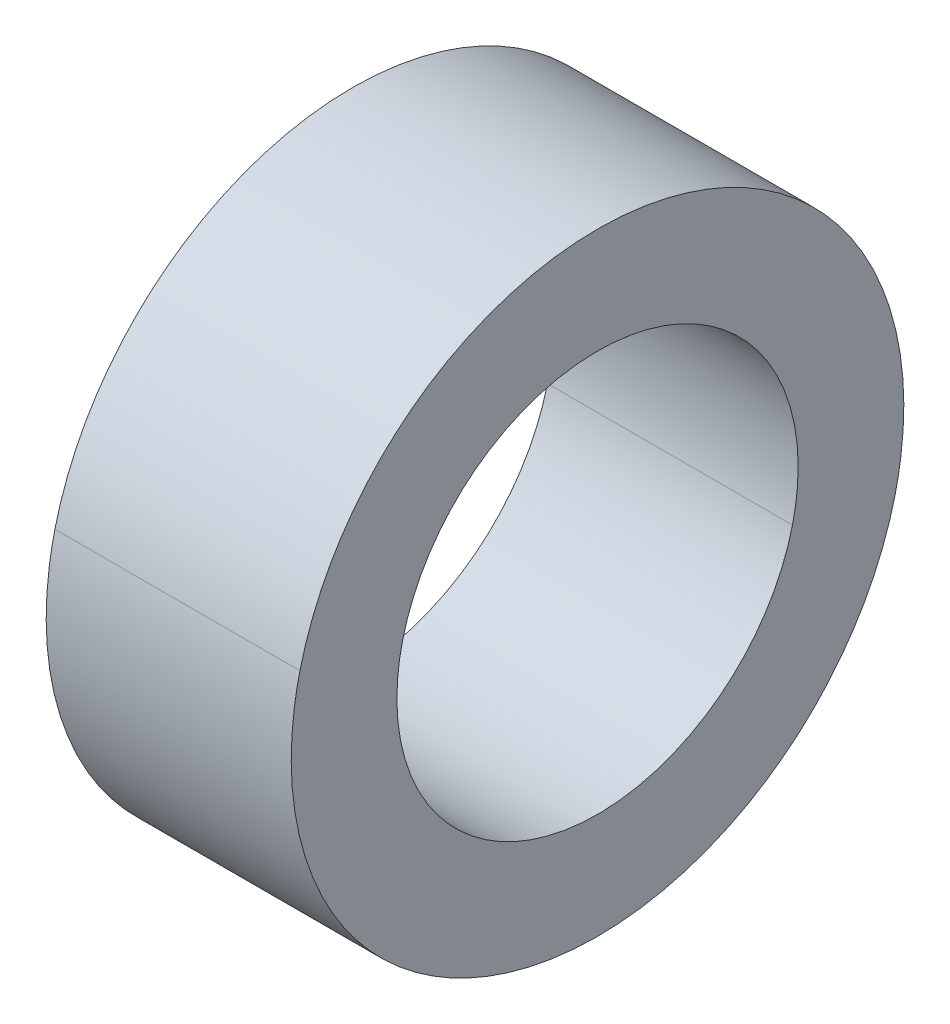
ISO-10303-21;
HEADER;
FILE_DESCRIPTION(('STEP AP214'),'2;1');
FILE_NAME('part.step','',(''),(''),'','','');
FILE_SCHEMA(('AUTOMOTIVE_DESIGN { 1 0 10303 214 1 1 1 1 }'));
ENDSEC;
DATA;
#1=APPLICATION_CONTEXT('core data for automotive mechanical design processes');
#2=APPLICATION_PROTOCOL_DEFINITION('international standard','automotive_design',2000,#1);
#3=PRODUCT_CONTEXT('',#1,'mechanical');
#4=PRODUCT('Part','Part','',(#3));
#5=PRODUCT_RELATED_PRODUCT_CATEGORY('part','',(#4));
#6=PRODUCT_DEFINITION_FORMATION('','',#4);
#7=PRODUCT_DEFINITION_CONTEXT('part definition',#1,'design');
#8=PRODUCT_DEFINITION('design','',#6,#7);
#9=PRODUCT_DEFINITION_SHAPE('','',#8);
#10=(LENGTH_UNIT() NAMED_UNIT(*) SI_UNIT(.MILLI.,.METRE.));
#11=(NAMED_UNIT(*) PLANE_ANGLE_UNIT() SI_UNIT($,.RADIAN.));
#12=(NAMED_UNIT(*) SI_UNIT($,.STERADIAN.) SOLID_ANGLE_UNIT());
#13=UNCERTAINTY_MEASURE_WITH_UNIT(LENGTH_MEASURE(1.E-05),#10,'distance_accuracy_value','');
#14=(GEOMETRIC_REPRESENTATION_CONTEXT(3) GLOBAL_UNCERTAINTY_ASSIGNED_CONTEXT((#13)) GLOBAL_UNIT_ASSIGNED_CONTEXT((#10,
#11,#12)) REPRESENTATION_CONTEXT('',''));
#15=CARTESIAN_POINT('',(0.,0.,0.));
#16=DIRECTION('',(0.,0.,1.));
#17=DIRECTION('',(1.,0.,0.));
#18=AXIS2_PLACEMENT_3D('',#15,#16,#17);
#19=CARTESIAN_POINT('',(187.365281719252,-132.785418384437,252.407317646361));
#20=CARTESIAN_POINT('',(187.365281719252,-135.311430174497,253.023162136859));
#21=CARTESIAN_POINT('',(187.365281719252,-135.927274664995,250.497150346798));
#22=CARTESIAN_POINT('',(187.365281719252,-136.543119155492,247.971138556738));
#23=CARTESIAN_POINT('',(187.365281719252,-134.017107365432,247.355294066241));
#24=CARTESIAN_POINT('',(190.540281719252,-132.785418384437,252.407317646361));
#25=CARTESIAN_POINT('',(190.540281719252,-135.311430174497,253.023162136859));
#26=CARTESIAN_POINT('',(190.540281719252,-135.927274664995,250.497150346798));
#27=CARTESIAN_POINT('',(190.540281719252,-136.543119155492,247.971138556738));
#28=CARTESIAN_POINT('',(190.540281719252,-134.017107365432,247.355294066241));
#29=(BOUNDED_SURFACE() B_SPLINE_SURFACE(1,2,((#19,#20,#21,#22,#23),(#24,#25,#26,#27,#28)),
.UNSPECIFIED.,.F.,.F.,.F.) B_SPLINE_SURFACE_WITH_KNOTS((2,2),(3,2,3),(0.,3.175),
(1.5707963267949,3.14159265358979,4.71238898038469),
.UNSPECIFIED.) GEOMETRIC_REPRESENTATION_ITEM() RATIONAL_B_SPLINE_SURFACE(((1.,0.707106781186548,
1.,0.707106781186548,1.),(1.,0.707106781186548,1.,0.707106781186548,1.))) REPRESENTATION_ITEM('') SURFACE());
#30=CARTESIAN_POINT('',(187.365281719252,-134.017107365432,247.355294066241));
#31=CARTESIAN_POINT('',(190.540281719252,-134.017107365432,247.355294066241));
#32=(BOUNDED_CURVE() B_SPLINE_CURVE(1,(#30,#31),.UNSPECIFIED.,.F.,
.F.) B_SPLINE_CURVE_WITH_KNOTS((2,2),(0.,3.175),
.UNSPECIFIED.) CURVE() GEOMETRIC_REPRESENTATION_ITEM() RATIONAL_B_SPLINE_CURVE((1.,1.)) REPRESENTATION_ITEM(''));
#33=CARTESIAN_POINT('',(187.365281719252,-134.017107365432,247.355294066241));
#34=VERTEX_POINT('',#33);
#35=CARTESIAN_POINT('',(190.540281719252,-134.017107365432,247.355294066241));
#36=VERTEX_POINT('',#35);
#37=EDGE_CURVE('E64',#34,#36,#32,.T.);
#38=CARTESIAN_POINT('',(187.365281719252,-134.017107365432,247.355294066241));
#39=CARTESIAN_POINT('',(187.365281719252,-136.543119155492,247.971138556738));
#40=CARTESIAN_POINT('',(187.365281719252,-135.927274664995,250.497150346798));
#41=CARTESIAN_POINT('',(187.365281719252,-135.311430174497,253.023162136859));
#42=CARTESIAN_POINT('',(187.365281719252,-132.785418384437,252.407317646361));
#43=(BOUNDED_CURVE() B_SPLINE_CURVE(2,(#38,#39,#40,#41,#42),.UNSPECIFIED.,.F.,
.F.) B_SPLINE_CURVE_WITH_KNOTS((3,2,3),(0.,4.08407044966673,8.16814089933346),
.UNSPECIFIED.) CURVE() GEOMETRIC_REPRESENTATION_ITEM() RATIONAL_B_SPLINE_CURVE((1.,
0.707106781186548,1.,0.707106781186548,1.)) REPRESENTATION_ITEM(''));
#44=CARTESIAN_POINT('',(187.365281719252,-132.785418384437,252.407317646361));
#45=VERTEX_POINT('',#44);
#46=EDGE_CURVE('E128',#34,#45,#43,.T.);
#47=CARTESIAN_POINT('',(187.365281719252,-132.785418384437,252.407317646361));
#48=CARTESIAN_POINT('',(190.540281719252,-132.785418384437,252.407317646361));
#49=(BOUNDED_CURVE() B_SPLINE_CURVE(1,(#47,#48),.UNSPECIFIED.,.F.,
.F.) B_SPLINE_CURVE_WITH_KNOTS((2,2),(0.,3.175),
.UNSPECIFIED.) CURVE() GEOMETRIC_REPRESENTATION_ITEM() RATIONAL_B_SPLINE_CURVE((1.,1.)) REPRESENTATION_ITEM(''));
#50=CARTESIAN_POINT('',(190.540281719252,-132.785418384437,252.407317646361));
#51=VERTEX_POINT('',#50);
#52=EDGE_CURVE('E11',#45,#51,#49,.T.);
#53=CARTESIAN_POINT('',(190.540281719252,-134.017107365432,247.355294066241));
#54=CARTESIAN_POINT('',(190.540281719252,-136.543119155492,247.971138556738));
#55=CARTESIAN_POINT('',(190.540281719252,-135.927274664995,250.497150346798));
#56=CARTESIAN_POINT('',(190.540281719252,-135.311430174497,253.023162136859));
#57=CARTESIAN_POINT('',(190.540281719252,-132.785418384437,252.407317646361));
#58=(BOUNDED_CURVE() B_SPLINE_CURVE(2,(#53,#54,#55,#56,#57),.UNSPECIFIED.,.F.,
.F.) B_SPLINE_CURVE_WITH_KNOTS((3,2,3),(0.,4.08407044966673,8.16814089933346),
.UNSPECIFIED.) CURVE() GEOMETRIC_REPRESENTATION_ITEM() RATIONAL_B_SPLINE_CURVE((1.,
0.707106781186548,1.,0.707106781186548,1.)) REPRESENTATION_ITEM(''));
#59=EDGE_CURVE('E124',#36,#51,#58,.T.);
#60=ORIENTED_EDGE('',*,*,#37,.F.);
#61=ORIENTED_EDGE('',*,*,#46,.T.);
#62=ORIENTED_EDGE('',*,*,#52,.T.);
#63=ORIENTED_EDGE('',*,*,#59,.F.);
#64=EDGE_LOOP('',(#60,#61,#62,#63));
#65=FACE_BOUND('',#64,.T.);
#66=ADVANCED_FACE('F51',(#65),#29,.T.);
#67=CARTESIAN_POINT('',(187.365281719252,-132.46121178968,253.737117122379));
#68=CARTESIAN_POINT('',(190.540281719252,-132.46121178968,253.737117122379));
#69=CARTESIAN_POINT('',(187.365281719252,-136.317023055758,254.677168207633));
#70=CARTESIAN_POINT('',(190.540281719252,-136.317023055758,254.677168207633));
#71=CARTESIAN_POINT('',(187.365281719252,-137.257074141012,250.821356941555));
#72=CARTESIAN_POINT('',(190.540281719252,-137.257074141012,250.821356941555));
#73=CARTESIAN_POINT('',(187.365281719252,-138.197125226266,246.965545675478));
#74=CARTESIAN_POINT('',(190.540281719252,-138.197125226266,246.965545675478));
#75=CARTESIAN_POINT('',(187.365281719252,-134.341313960189,246.025494590223));
#76=CARTESIAN_POINT('',(190.540281719252,-134.341313960189,246.025494590223));
#77=(BOUNDED_SURFACE() B_SPLINE_SURFACE(2,1,((#67,#68),(#69,#70),(#71,#72),(#73,#74),(#75,#76)),
.UNSPECIFIED.,.F.,.F.,.F.) B_SPLINE_SURFACE_WITH_KNOTS((3,2,3),(2,2),(1.5707963267949,
3.14159265358979,4.71238898038469),(0.,3.175),
.UNSPECIFIED.) GEOMETRIC_REPRESENTATION_ITEM() RATIONAL_B_SPLINE_SURFACE(((1.,1.),
(0.707106781186547,0.707106781186547),(1.,1.),(0.707106781186547,0.707106781186547),(1.,1.))) REPRESENTATION_ITEM('') SURFACE());
#78=CARTESIAN_POINT('',(187.365281719252,-134.341313960189,246.025494590223));
#79=CARTESIAN_POINT('',(190.540281719252,-134.341313960189,246.025494590223));
#80=(BOUNDED_CURVE() B_SPLINE_CURVE(1,(#78,#79),.UNSPECIFIED.,.F.,
.F.) B_SPLINE_CURVE_WITH_KNOTS((2,2),(0.,3.175),
.UNSPECIFIED.) CURVE() GEOMETRIC_REPRESENTATION_ITEM() RATIONAL_B_SPLINE_CURVE((1.,1.)) REPRESENTATION_ITEM(''));
#81=CARTESIAN_POINT('',(187.365281719252,-134.341313960189,246.025494590223));
#82=VERTEX_POINT('',#81);
#83=CARTESIAN_POINT('',(190.540281719252,-134.341313960189,246.025494590223));
#84=VERTEX_POINT('',#83);
#85=EDGE_CURVE('E118',#82,#84,#80,.T.);
#86=CARTESIAN_POINT('',(190.540281719252,-134.341313960189,246.025494590223));
#87=CARTESIAN_POINT('',(190.540281719252,-138.197125226266,246.965545675478));
#88=CARTESIAN_POINT('',(190.540281719252,-137.257074141012,250.821356941555));
#89=CARTESIAN_POINT('',(190.540281719252,-136.317023055758,254.677168207633));
#90=CARTESIAN_POINT('',(190.540281719252,-132.46121178968,253.737117122379));
#91=(BOUNDED_CURVE() B_SPLINE_CURVE(2,(#86,#87,#88,#89,#90),.UNSPECIFIED.,.F.,
.F.) B_SPLINE_CURVE_WITH_KNOTS((3,2,3),(0.,6.23409792196725,12.4681958439345),
.UNSPECIFIED.) CURVE() GEOMETRIC_REPRESENTATION_ITEM() RATIONAL_B_SPLINE_CURVE((1.,
0.707106781186548,1.,0.707106781186548,1.)) REPRESENTATION_ITEM(''));
#92=CARTESIAN_POINT('',(190.540281719252,-132.46121178968,253.737117122379));
#93=VERTEX_POINT('',#92);
#94=EDGE_CURVE('E121',#84,#93,#91,.T.);
#95=CARTESIAN_POINT('',(187.365281719252,-132.46121178968,253.737117122379));
#96=CARTESIAN_POINT('',(190.540281719252,-132.46121178968,253.737117122379));
#97=(BOUNDED_CURVE() B_SPLINE_CURVE(1,(#95,#96),.UNSPECIFIED.,.F.,
.F.) B_SPLINE_CURVE_WITH_KNOTS((2,2),(0.,3.175),
.UNSPECIFIED.) CURVE() GEOMETRIC_REPRESENTATION_ITEM() RATIONAL_B_SPLINE_CURVE((1.,1.)) REPRESENTATION_ITEM(''));
#98=CARTESIAN_POINT('',(187.365281719252,-132.46121178968,253.737117122379));
#99=VERTEX_POINT('',#98);
#100=EDGE_CURVE('E106',#99,#93,#97,.T.);
#101=CARTESIAN_POINT('',(187.365281719252,-134.341313960189,246.025494590223));
#102=CARTESIAN_POINT('',(187.365281719252,-138.197125226266,246.965545675478));
#103=CARTESIAN_POINT('',(187.365281719252,-137.257074141012,250.821356941555));
#104=CARTESIAN_POINT('',(187.365281719252,-136.317023055758,254.677168207633));
#105=CARTESIAN_POINT('',(187.365281719252,-132.46121178968,253.737117122379));
#106=(BOUNDED_CURVE() B_SPLINE_CURVE(2,(#101,#102,#103,#104,#105),.UNSPECIFIED.,.F.,
.F.) B_SPLINE_CURVE_WITH_KNOTS((3,2,3),(0.,6.23409792196725,12.4681958439345),
.UNSPECIFIED.) CURVE() GEOMETRIC_REPRESENTATION_ITEM() RATIONAL_B_SPLINE_CURVE((1.,
0.707106781186548,1.,0.707106781186548,1.)) REPRESENTATION_ITEM(''));
#107=EDGE_CURVE('E213',#82,#99,#106,.T.);
#108=ORIENTED_EDGE('',*,*,#85,.T.);
#109=ORIENTED_EDGE('',*,*,#94,.T.);
#110=ORIENTED_EDGE('',*,*,#100,.F.);
#111=ORIENTED_EDGE('',*,*,#107,.F.);
#112=EDGE_LOOP('',(#108,#109,#110,#111));
#113=FACE_BOUND('',#112,.T.);
#114=ADVANCED_FACE('F53',(#113),#77,.T.);
#115=CARTESIAN_POINT('',(187.365281719252,-134.017107365432,247.355294066241));
#116=CARTESIAN_POINT('',(187.365281719252,-131.491095575371,246.739449575743));
#117=CARTESIAN_POINT('',(187.365281719252,-130.875251084874,249.265461365804));
#118=CARTESIAN_POINT('',(187.365281719252,-130.259406594377,251.791473155864));
#119=CARTESIAN_POINT('',(187.365281719252,-132.785418384437,252.407317646361));
#120=CARTESIAN_POINT('',(190.540281719252,-134.017107365432,247.355294066241));
#121=CARTESIAN_POINT('',(190.540281719252,-131.491095575371,246.739449575743));
#122=CARTESIAN_POINT('',(190.540281719252,-130.875251084874,249.265461365804));
#123=CARTESIAN_POINT('',(190.540281719252,-130.259406594377,251.791473155864));
#124=CARTESIAN_POINT('',(190.540281719252,-132.785418384437,252.407317646361));
#125=(BOUNDED_SURFACE() B_SPLINE_SURFACE(1,2,((#115,#116,#117,#118,#119),(#120,#121,#122,#123,
#124)),.UNSPECIFIED.,.F.,.F.,.F.) B_SPLINE_SURFACE_WITH_KNOTS((2,2),(3,2,3),(0.,3.175),
(1.5707963267949,3.14159265358979,4.71238898038469),
.UNSPECIFIED.) GEOMETRIC_REPRESENTATION_ITEM() RATIONAL_B_SPLINE_SURFACE(((1.,0.707106781186548,
1.,0.707106781186548,1.),(1.,0.707106781186548,1.,0.707106781186548,1.))) REPRESENTATION_ITEM('') SURFACE());
#126=CARTESIAN_POINT('',(190.540281719252,-132.785418384437,252.407317646361));
#127=CARTESIAN_POINT('',(190.540281719252,-130.259406594377,251.791473155864));
#128=CARTESIAN_POINT('',(190.540281719252,-130.875251084874,249.265461365804));
#129=CARTESIAN_POINT('',(190.540281719252,-131.491095575371,246.739449575743));
#130=CARTESIAN_POINT('',(190.540281719252,-134.017107365432,247.355294066241));
#131=(BOUNDED_CURVE() B_SPLINE_CURVE(2,(#126,#127,#128,#129,#130),.UNSPECIFIED.,.F.,
.F.) B_SPLINE_CURVE_WITH_KNOTS((3,2,3),(0.,4.08407044966673,8.16814089933346),
.UNSPECIFIED.) CURVE() GEOMETRIC_REPRESENTATION_ITEM() RATIONAL_B_SPLINE_CURVE((1.,
0.707106781186548,1.,0.707106781186548,1.)) REPRESENTATION_ITEM(''));
#132=EDGE_CURVE('E154',#51,#36,#131,.T.);
#133=CARTESIAN_POINT('',(187.365281719252,-132.785418384437,252.407317646361));
#134=CARTESIAN_POINT('',(187.365281719252,-130.259406594377,251.791473155864));
#135=CARTESIAN_POINT('',(187.365281719252,-130.875251084874,249.265461365804));
#136=CARTESIAN_POINT('',(187.365281719252,-131.491095575371,246.739449575743));
#137=CARTESIAN_POINT('',(187.365281719252,-134.017107365432,247.355294066241));
#138=(BOUNDED_CURVE() B_SPLINE_CURVE(2,(#133,#134,#135,#136,#137),.UNSPECIFIED.,.F.,
.F.) B_SPLINE_CURVE_WITH_KNOTS((3,2,3),(0.,4.08407044966673,8.16814089933346),
.UNSPECIFIED.) CURVE() GEOMETRIC_REPRESENTATION_ITEM() RATIONAL_B_SPLINE_CURVE((1.,
0.707106781186548,1.,0.707106781186548,1.)) REPRESENTATION_ITEM(''));
#139=EDGE_CURVE('E133',#45,#34,#138,.T.);
#140=ORIENTED_EDGE('',*,*,#37,.T.);
#141=ORIENTED_EDGE('',*,*,#132,.F.);
#142=ORIENTED_EDGE('',*,*,#52,.F.);
#143=ORIENTED_EDGE('',*,*,#139,.T.);
#144=EDGE_LOOP('',(#140,#141,#142,#143));
#145=FACE_BOUND('',#144,.T.);
#146=ADVANCED_FACE('F245',(#145),#125,.T.);
#147=CARTESIAN_POINT('',(187.365281719252,-134.341313960189,246.025494590223));
#148=CARTESIAN_POINT('',(190.540281719252,-134.341313960189,246.025494590223));
#149=CARTESIAN_POINT('',(187.365281719252,-130.485502694111,245.085443504969));
#150=CARTESIAN_POINT('',(190.540281719252,-130.485502694111,245.085443504969));
#151=CARTESIAN_POINT('',(187.365281719252,-129.545451608857,248.941254771047));
#152=CARTESIAN_POINT('',(190.540281719252,-129.545451608857,248.941254771047));
#153=CARTESIAN_POINT('',(187.365281719252,-128.605400523602,252.797066037124));
#154=CARTESIAN_POINT('',(190.540281719252,-128.605400523602,252.797066037124));
#155=CARTESIAN_POINT('',(187.365281719252,-132.46121178968,253.737117122379));
#156=CARTESIAN_POINT('',(190.540281719252,-132.46121178968,253.737117122379));
#157=(BOUNDED_SURFACE() B_SPLINE_SURFACE(2,1,((#147,#148),(#149,#150),(#151,#152),(#153,#154),
(#155,#156)),.UNSPECIFIED.,.F.,.F.,.F.) B_SPLINE_SURFACE_WITH_KNOTS((3,2,3),(2,2),
(1.5707963267949,3.14159265358979,4.71238898038469),(0.,3.175),
.UNSPECIFIED.) GEOMETRIC_REPRESENTATION_ITEM() RATIONAL_B_SPLINE_SURFACE(((1.,1.),
(0.707106781186547,0.707106781186547),(1.,1.),(0.707106781186547,0.707106781186547),(1.,1.))) REPRESENTATION_ITEM('') SURFACE());
#158=CARTESIAN_POINT('',(187.365281719252,-132.46121178968,253.737117122379));
#159=CARTESIAN_POINT('',(187.365281719252,-128.605400523602,252.797066037124));
#160=CARTESIAN_POINT('',(187.365281719252,-129.545451608857,248.941254771047));
#161=CARTESIAN_POINT('',(187.365281719252,-130.485502694111,245.085443504969));
#162=CARTESIAN_POINT('',(187.365281719252,-134.341313960189,246.025494590223));
#163=(BOUNDED_CURVE() B_SPLINE_CURVE(2,(#158,#159,#160,#161,#162),.UNSPECIFIED.,.F.,
.F.) B_SPLINE_CURVE_WITH_KNOTS((3,2,3),(0.,6.23409792196725,12.4681958439345),
.UNSPECIFIED.) CURVE() GEOMETRIC_REPRESENTATION_ITEM() RATIONAL_B_SPLINE_CURVE((1.,
0.707106781186548,1.,0.707106781186548,1.)) REPRESENTATION_ITEM(''));
#164=EDGE_CURVE('E113',#99,#82,#163,.T.);
#165=CARTESIAN_POINT('',(190.540281719252,-132.46121178968,253.737117122379));
#166=CARTESIAN_POINT('',(190.540281719252,-128.605400523602,252.797066037124));
#167=CARTESIAN_POINT('',(190.540281719252,-129.545451608857,248.941254771047));
#168=CARTESIAN_POINT('',(190.540281719252,-130.485502694111,245.085443504969));
#169=CARTESIAN_POINT('',(190.540281719252,-134.341313960189,246.025494590223));
#170=(BOUNDED_CURVE() B_SPLINE_CURVE(2,(#165,#166,#167,#168,#169),.UNSPECIFIED.,.F.,
.F.) B_SPLINE_CURVE_WITH_KNOTS((3,2,3),(0.,6.23409792196725,12.4681958439345),
.UNSPECIFIED.) CURVE() GEOMETRIC_REPRESENTATION_ITEM() RATIONAL_B_SPLINE_CURVE((1.,
0.707106781186548,1.,0.707106781186548,1.)) REPRESENTATION_ITEM(''));
#171=EDGE_CURVE('E111',#93,#84,#170,.T.);
#172=ORIENTED_EDGE('',*,*,#85,.F.);
#173=ORIENTED_EDGE('',*,*,#164,.F.);
#174=ORIENTED_EDGE('',*,*,#100,.T.);
#175=ORIENTED_EDGE('',*,*,#171,.T.);
#176=EDGE_LOOP('',(#172,#173,#174,#175));
#177=FACE_BOUND('',#176,.T.);
#178=ADVANCED_FACE('F109',(#177),#157,.T.);
#179=CARTESIAN_POINT('',(190.540281719252,-128.605400523602,252.797066037124));
#180=DIRECTION('',(1.,0.,0.));
#181=DIRECTION('',(0.,1.,0.));
#182=AXIS2_PLACEMENT_3D('',#179,#180,#181);
#183=PLANE('',#182);
#184=ORIENTED_EDGE('',*,*,#59,.T.);
#185=ORIENTED_EDGE('',*,*,#132,.T.);
#186=EDGE_LOOP('',(#184,#185));
#187=FACE_BOUND('',#186,.T.);
#188=ORIENTED_EDGE('',*,*,#171,.F.);
#189=ORIENTED_EDGE('',*,*,#94,.F.);
#190=EDGE_LOOP('',(#188,#189));
#191=FACE_BOUND('',#190,.T.);
#192=ADVANCED_FACE('F126',(#187,#191),#183,.T.);
#193=CARTESIAN_POINT('',(187.365281719252,-128.605400523602,252.797066037124));
#194=DIRECTION('',(-1.,0.,0.));
#195=DIRECTION('',(0.,0.,1.));
#196=AXIS2_PLACEMENT_3D('',#193,#194,#195);
#197=PLANE('',#196);
#198=ORIENTED_EDGE('',*,*,#139,.F.);
#199=ORIENTED_EDGE('',*,*,#46,.F.);
#200=EDGE_LOOP('',(#198,#199));
#201=FACE_BOUND('',#200,.T.);
#202=ORIENTED_EDGE('',*,*,#107,.T.);
#203=ORIENTED_EDGE('',*,*,#164,.T.);
#204=EDGE_LOOP('',(#202,#203));
#205=FACE_BOUND('',#204,.T.);
#206=ADVANCED_FACE('F238',(#201,#205),#197,.T.);
#207=CLOSED_SHELL('',(#66,#114,#146,#178,#192,#206));
#208=MANIFOLD_SOLID_BREP('B2',#207);
#209=ADVANCED_BREP_SHAPE_REPRESENTATION('',(#18,#208),#14);
#210=SHAPE_DEFINITION_REPRESENTATION(#9,#209);
ENDSEC;
END-ISO-10303-21;
